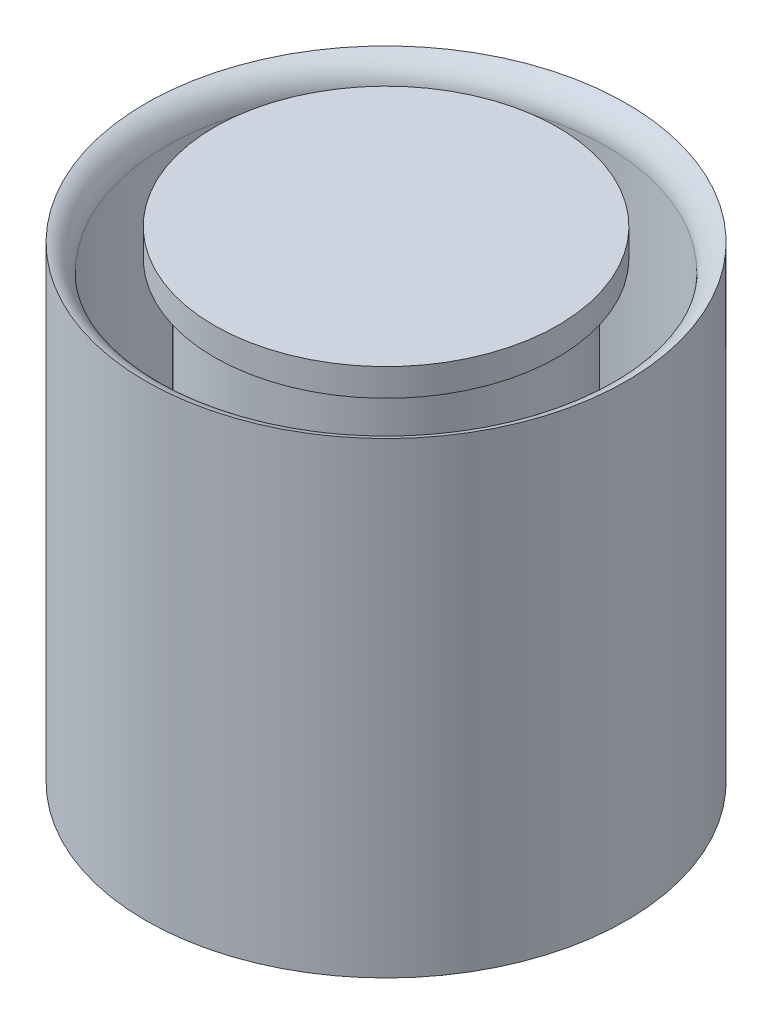
ISO-10303-21;
HEADER;
FILE_DESCRIPTION(('STEP AP214'),'2;1');
FILE_NAME('part.step','',(''),(''),'','','');
FILE_SCHEMA(('AUTOMOTIVE_DESIGN { 1 0 10303 214 1 1 1 1 }'));
ENDSEC;
DATA;
#1=APPLICATION_CONTEXT('core data for automotive mechanical design processes');
#2=APPLICATION_PROTOCOL_DEFINITION('international standard','automotive_design',2000,#1);
#3=PRODUCT_CONTEXT('',#1,'mechanical');
#4=PRODUCT('Part','Part','',(#3));
#5=PRODUCT_RELATED_PRODUCT_CATEGORY('part','',(#4));
#6=PRODUCT_DEFINITION_FORMATION('','',#4);
#7=PRODUCT_DEFINITION_CONTEXT('part definition',#1,'design');
#8=PRODUCT_DEFINITION('design','',#6,#7);
#9=PRODUCT_DEFINITION_SHAPE('','',#8);
#10=(LENGTH_UNIT() NAMED_UNIT(*) SI_UNIT(.MILLI.,.METRE.));
#11=(NAMED_UNIT(*) PLANE_ANGLE_UNIT() SI_UNIT($,.RADIAN.));
#12=(NAMED_UNIT(*) SI_UNIT($,.STERADIAN.) SOLID_ANGLE_UNIT());
#13=UNCERTAINTY_MEASURE_WITH_UNIT(LENGTH_MEASURE(1.E-05),#10,'distance_accuracy_value','');
#14=(GEOMETRIC_REPRESENTATION_CONTEXT(3) GLOBAL_UNCERTAINTY_ASSIGNED_CONTEXT((#13)) GLOBAL_UNIT_ASSIGNED_CONTEXT((#10,
#11,#12)) REPRESENTATION_CONTEXT('',''));
#15=CARTESIAN_POINT('',(0.,0.,0.));
#16=DIRECTION('',(0.,0.,1.));
#17=DIRECTION('',(1.,0.,0.));
#18=AXIS2_PLACEMENT_3D('',#15,#16,#17);
#19=CARTESIAN_POINT('',(0.,-2.,-2.02225389211996E-12));
#20=DIRECTION('',(0.,1.,0.));
#21=DIRECTION('',(0.,0.,1.));
#22=AXIS2_PLACEMENT_3D('',#19,#20,#21);
#23=CYLINDRICAL_SURFACE('',#22,1.755);
#24=CARTESIAN_POINT('',(0.,9.,-2.02225389211996E-12));
#25=DIRECTION('',(0.,1.,0.));
#26=DIRECTION('',(0.,0.,1.));
#27=AXIS2_PLACEMENT_3D('',#24,#25,#26);
#28=CIRCLE('',#27,1.755);
#29=CARTESIAN_POINT('',(1.07743831409072,9.,-1.38533450088231));
#30=VERTEX_POINT('',#29);
#31=CARTESIAN_POINT('',(-1.07743831409082,9.,-1.38533450088231));
#32=VERTEX_POINT('',#31);
#33=EDGE_CURVE('E69',#30,#32,#28,.F.);
#34=ORIENTED_EDGE('',*,*,#33,.F.);
#35=DIRECTION('',(0.,1.,0.));
#36=VECTOR('',#35,1.);
#37=CARTESIAN_POINT('',(1.07743831409072,-2.,-1.38533450088231));
#38=LINE('',#37,#36);
#39=CARTESIAN_POINT('',(1.07743831409072,0.,-1.38533450088231));
#40=VERTEX_POINT('',#39);
#41=EDGE_CURVE('E62',#40,#30,#38,.T.);
#42=ORIENTED_EDGE('',*,*,#41,.F.);
#43=CARTESIAN_POINT('',(0.,0.,-2.02225389211996E-12));
#44=DIRECTION('',(0.,1.,0.));
#45=DIRECTION('',(0.,0.,1.));
#46=AXIS2_PLACEMENT_3D('',#43,#44,#45);
#47=CIRCLE('',#46,1.755);
#48=CARTESIAN_POINT('',(-1.07743831409082,0.,-1.38533450088231));
#49=VERTEX_POINT('',#48);
#50=EDGE_CURVE('E94',#49,#40,#47,.T.);
#51=ORIENTED_EDGE('',*,*,#50,.F.);
#52=DIRECTION('',(0.,1.,0.));
#53=VECTOR('',#52,1.);
#54=CARTESIAN_POINT('',(-1.07743831409082,-2.,-1.38533450088231));
#55=LINE('',#54,#53);
#56=EDGE_CURVE('E56',#49,#32,#55,.T.);
#57=ORIENTED_EDGE('',*,*,#56,.T.);
#58=EDGE_LOOP('',(#34,#42,#51,#57));
#59=FACE_BOUND('',#58,.T.);
#60=ADVANCED_FACE('F37',(#59),#23,.F.);
#61=CARTESIAN_POINT('',(-1.07743831409082,-2.,-1.38533450088231));
#62=DIRECTION('',(0.,0.,-1.));
#63=DIRECTION('',(-1.,0.,0.));
#64=AXIS2_PLACEMENT_3D('',#61,#62,#63);
#65=PLANE('',#64);
#66=DIRECTION('',(1.,0.,0.));
#67=VECTOR('',#66,1.);
#68=CARTESIAN_POINT('',(-1.07743831409082,9.,-1.38533450088231));
#69=LINE('',#68,#67);
#70=EDGE_CURVE('E52',#32,#30,#69,.T.);
#71=ORIENTED_EDGE('',*,*,#70,.F.);
#72=ORIENTED_EDGE('',*,*,#56,.F.);
#73=DIRECTION('',(-1.,0.,0.));
#74=VECTOR('',#73,1.);
#75=CARTESIAN_POINT('',(0.,0.,-1.38533450088231));
#76=LINE('',#75,#74);
#77=EDGE_CURVE('E66',#40,#49,#76,.T.);
#78=ORIENTED_EDGE('',*,*,#77,.F.);
#79=ORIENTED_EDGE('',*,*,#41,.T.);
#80=EDGE_LOOP('',(#71,#72,#78,#79));
#81=FACE_BOUND('',#80,.T.);
#82=ADVANCED_FACE('F64',(#81),#65,.F.);
#83=CARTESIAN_POINT('',(0.,0.,0.));
#84=DIRECTION('',(0.,1.,0.));
#85=DIRECTION('',(0.,0.,1.));
#86=AXIS2_PLACEMENT_3D('',#83,#84,#85);
#87=PLANE('',#86);
#88=ORIENTED_EDGE('',*,*,#77,.T.);
#89=ORIENTED_EDGE('',*,*,#50,.T.);
#90=EDGE_LOOP('',(#88,#89));
#91=FACE_BOUND('',#90,.T.);
#92=CARTESIAN_POINT('',(0.,0.,0.));
#93=DIRECTION('',(0.,1.,0.));
#94=DIRECTION('',(0.,0.,1.));
#95=AXIS2_PLACEMENT_3D('',#92,#93,#94);
#96=CIRCLE('',#95,17.5);
#97=CARTESIAN_POINT('',(0.,0.,17.5));
#98=VERTEX_POINT('',#97);
#99=EDGE_CURVE('E86',#98,#98,#96,.T.);
#100=ORIENTED_EDGE('',*,*,#99,.F.);
#101=EDGE_LOOP('',(#100));
#102=FACE_BOUND('',#101,.T.);
#103=ADVANCED_FACE('F125',(#91,#102),#87,.F.);
#104=CARTESIAN_POINT('',(0.,34.,0.));
#105=DIRECTION('',(0.,-1.,0.));
#106=DIRECTION('',(0.,0.,-1.));
#107=AXIS2_PLACEMENT_3D('',#104,#105,#106);
#108=CYLINDRICAL_SURFACE('',#107,17.5);
#109=CARTESIAN_POINT('',(0.,34.,0.));
#110=DIRECTION('',(0.,1.,0.));
#111=DIRECTION('',(0.,0.,1.));
#112=AXIS2_PLACEMENT_3D('',#109,#110,#111);
#113=CIRCLE('',#112,17.5);
#114=CARTESIAN_POINT('',(0.,34.,17.5));
#115=VERTEX_POINT('',#114);
#116=EDGE_CURVE('E85',#115,#115,#113,.T.);
#117=ORIENTED_EDGE('',*,*,#116,.F.);
#118=EDGE_LOOP('',(#117));
#119=FACE_BOUND('',#118,.T.);
#120=ORIENTED_EDGE('',*,*,#99,.T.);
#121=EDGE_LOOP('',(#120));
#122=FACE_BOUND('',#121,.T.);
#123=ADVANCED_FACE('F141',(#119,#122),#108,.T.);
#124=CARTESIAN_POINT('',(0.,34.,0.));
#125=DIRECTION('',(0.,-1.,0.));
#126=DIRECTION('',(0.,0.,-1.));
#127=AXIS2_PLACEMENT_3D('',#124,#125,#126);
#128=CYLINDRICAL_SURFACE('',#127,16.);
#129=CARTESIAN_POINT('',(0.,32.0635083268963,0.));
#130=DIRECTION('',(0.,1.,0.));
#131=DIRECTION('',(0.,0.,1.));
#132=AXIS2_PLACEMENT_3D('',#129,#130,#131);
#133=CIRCLE('',#132,16.);
#134=CARTESIAN_POINT('',(0.,32.0635083268963,16.));
#135=VERTEX_POINT('',#134);
#136=EDGE_CURVE('E76',#135,#135,#133,.T.);
#137=ORIENTED_EDGE('',*,*,#136,.T.);
#138=EDGE_LOOP('',(#137));
#139=FACE_BOUND('',#138,.T.);
#140=CARTESIAN_POINT('',(0.,3.,0.));
#141=DIRECTION('',(0.,1.,0.));
#142=DIRECTION('',(0.,0.,1.));
#143=AXIS2_PLACEMENT_3D('',#140,#141,#142);
#144=CIRCLE('',#143,16.);
#145=CARTESIAN_POINT('',(0.,3.,16.));
#146=VERTEX_POINT('',#145);
#147=EDGE_CURVE('E80',#146,#146,#144,.T.);
#148=ORIENTED_EDGE('',*,*,#147,.F.);
#149=EDGE_LOOP('',(#148));
#150=FACE_BOUND('',#149,.T.);
#151=ADVANCED_FACE('F137',(#139,#150),#128,.F.);
#152=CARTESIAN_POINT('',(0.,3.,0.));
#153=DIRECTION('',(0.,1.,0.));
#154=DIRECTION('',(0.,0.,1.));
#155=AXIS2_PLACEMENT_3D('',#152,#153,#154);
#156=PLANE('',#155);
#157=CARTESIAN_POINT('',(0.,3.,0.));
#158=DIRECTION('',(0.,1.,0.));
#159=DIRECTION('',(0.,0.,1.));
#160=AXIS2_PLACEMENT_3D('',#157,#158,#159);
#161=CIRCLE('',#160,12.5);
#162=CARTESIAN_POINT('',(0.,3.,12.5));
#163=VERTEX_POINT('',#162);
#164=EDGE_CURVE('E11',#163,#163,#161,.F.);
#165=ORIENTED_EDGE('',*,*,#164,.T.);
#166=EDGE_LOOP('',(#165));
#167=FACE_BOUND('',#166,.T.);
#168=ORIENTED_EDGE('',*,*,#147,.T.);
#169=EDGE_LOOP('',(#168));
#170=FACE_BOUND('',#169,.T.);
#171=ADVANCED_FACE('F134',(#167,#170),#156,.T.);
#172=CARTESIAN_POINT('',(0.,32.0635083268963,0.));
#173=DIRECTION('',(0.,1.,0.));
#174=DIRECTION('',(0.,0.,1.));
#175=AXIS2_PLACEMENT_3D('',#172,#173,#174);
#176=TOROIDAL_SURFACE('',#175,18.,2.);
#177=ORIENTED_EDGE('',*,*,#116,.T.);
#178=EDGE_LOOP('',(#177));
#179=FACE_BOUND('',#178,.T.);
#180=ORIENTED_EDGE('',*,*,#136,.F.);
#181=EDGE_LOOP('',(#180));
#182=FACE_BOUND('',#181,.T.);
#183=ADVANCED_FACE('F132',(#179,#182),#176,.T.);
#184=CARTESIAN_POINT('',(0.,33.,0.));
#185=DIRECTION('',(0.,-1.,0.));
#186=DIRECTION('',(0.,0.,-1.));
#187=AXIS2_PLACEMENT_3D('',#184,#185,#186);
#188=CYLINDRICAL_SURFACE('',#187,11.);
#189=CARTESIAN_POINT('',(0.,4.5,0.));
#190=DIRECTION('',(0.,1.,0.));
#191=DIRECTION('',(0.,0.,1.));
#192=AXIS2_PLACEMENT_3D('',#189,#190,#191);
#193=CIRCLE('',#192,11.);
#194=CARTESIAN_POINT('',(0.,4.5,11.));
#195=VERTEX_POINT('',#194);
#196=EDGE_CURVE('E45',#195,#195,#193,.T.);
#197=ORIENTED_EDGE('',*,*,#196,.T.);
#198=EDGE_LOOP('',(#197));
#199=FACE_BOUND('',#198,.T.);
#200=CARTESIAN_POINT('',(0.,33.,0.));
#201=DIRECTION('',(0.,1.,0.));
#202=DIRECTION('',(0.,0.,1.));
#203=AXIS2_PLACEMENT_3D('',#200,#201,#202);
#204=CIRCLE('',#203,11.);
#205=CARTESIAN_POINT('',(0.,33.,11.));
#206=VERTEX_POINT('',#205);
#207=EDGE_CURVE('E89',#206,#206,#204,.T.);
#208=ORIENTED_EDGE('',*,*,#207,.F.);
#209=EDGE_LOOP('',(#208));
#210=FACE_BOUND('',#209,.T.);
#211=ADVANCED_FACE('F129',(#199,#210),#188,.T.);
#212=CARTESIAN_POINT('',(0.,9.,0.));
#213=DIRECTION('',(0.,1.,0.));
#214=DIRECTION('',(0.,0.,1.));
#215=AXIS2_PLACEMENT_3D('',#212,#213,#214);
#216=PLANE('',#215);
#217=ORIENTED_EDGE('',*,*,#70,.T.);
#218=ORIENTED_EDGE('',*,*,#33,.T.);
#219=EDGE_LOOP('',(#217,#218));
#220=FACE_BOUND('',#219,.T.);
#221=ADVANCED_FACE('F75',(#220),#216,.F.);
#222=CARTESIAN_POINT('',(0.,4.5,0.));
#223=DIRECTION('',(0.,1.,0.));
#224=DIRECTION('',(0.,0.,1.));
#225=AXIS2_PLACEMENT_3D('',#222,#223,#224);
#226=TOROIDAL_SURFACE('',#225,12.5,1.5);
#227=ORIENTED_EDGE('',*,*,#164,.F.);
#228=EDGE_LOOP('',(#227));
#229=FACE_BOUND('',#228,.T.);
#230=ORIENTED_EDGE('',*,*,#196,.F.);
#231=EDGE_LOOP('',(#230));
#232=FACE_BOUND('',#231,.T.);
#233=ADVANCED_FACE('F39',(#229,#232),#226,.F.);
#234=CARTESIAN_POINT('',(0.,35.,0.));
#235=DIRECTION('',(0.,-1.,0.));
#236=DIRECTION('',(0.,0.,-1.));
#237=AXIS2_PLACEMENT_3D('',#234,#235,#236);
#238=CYLINDRICAL_SURFACE('',#237,12.5);
#239=CARTESIAN_POINT('',(0.,35.,0.));
#240=DIRECTION('',(0.,1.,0.));
#241=DIRECTION('',(0.,0.,1.));
#242=AXIS2_PLACEMENT_3D('',#239,#240,#241);
#243=CIRCLE('',#242,12.5);
#244=CARTESIAN_POINT('',(0.,35.,12.5));
#245=VERTEX_POINT('',#244);
#246=EDGE_CURVE('E73',#245,#245,#243,.T.);
#247=ORIENTED_EDGE('',*,*,#246,.F.);
#248=EDGE_LOOP('',(#247));
#249=FACE_BOUND('',#248,.T.);
#250=CARTESIAN_POINT('',(0.,33.,0.));
#251=DIRECTION('',(0.,1.,0.));
#252=DIRECTION('',(0.,0.,1.));
#253=AXIS2_PLACEMENT_3D('',#250,#251,#252);
#254=CIRCLE('',#253,12.5);
#255=CARTESIAN_POINT('',(0.,33.,12.5));
#256=VERTEX_POINT('',#255);
#257=EDGE_CURVE('E98',#256,#256,#254,.T.);
#258=ORIENTED_EDGE('',*,*,#257,.T.);
#259=EDGE_LOOP('',(#258));
#260=FACE_BOUND('',#259,.T.);
#261=ADVANCED_FACE('F106',(#249,#260),#238,.T.);
#262=CARTESIAN_POINT('',(0.,35.,0.));
#263=DIRECTION('',(0.,1.,0.));
#264=DIRECTION('',(0.,0.,1.));
#265=AXIS2_PLACEMENT_3D('',#262,#263,#264);
#266=PLANE('',#265);
#267=ORIENTED_EDGE('',*,*,#246,.T.);
#268=EDGE_LOOP('',(#267));
#269=FACE_BOUND('',#268,.T.);
#270=ADVANCED_FACE('F104',(#269),#266,.T.);
#271=CARTESIAN_POINT('',(0.,33.,0.));
#272=DIRECTION('',(0.,1.,0.));
#273=DIRECTION('',(0.,0.,1.));
#274=AXIS2_PLACEMENT_3D('',#271,#272,#273);
#275=PLANE('',#274);
#276=ORIENTED_EDGE('',*,*,#207,.T.);
#277=EDGE_LOOP('',(#276));
#278=FACE_BOUND('',#277,.T.);
#279=ORIENTED_EDGE('',*,*,#257,.F.);
#280=EDGE_LOOP('',(#279));
#281=FACE_BOUND('',#280,.T.);
#282=ADVANCED_FACE('F112',(#278,#281),#275,.F.);
#283=CLOSED_SHELL('',(#60,#82,#103,#123,#151,#171,#183,#211,#221,#233,#261,#270,#282));
#284=MANIFOLD_SOLID_BREP('B2',#283);
#285=ADVANCED_BREP_SHAPE_REPRESENTATION('',(#18,#284),#14);
#286=SHAPE_DEFINITION_REPRESENTATION(#9,#285);
ENDSEC;
END-ISO-10303-21;
